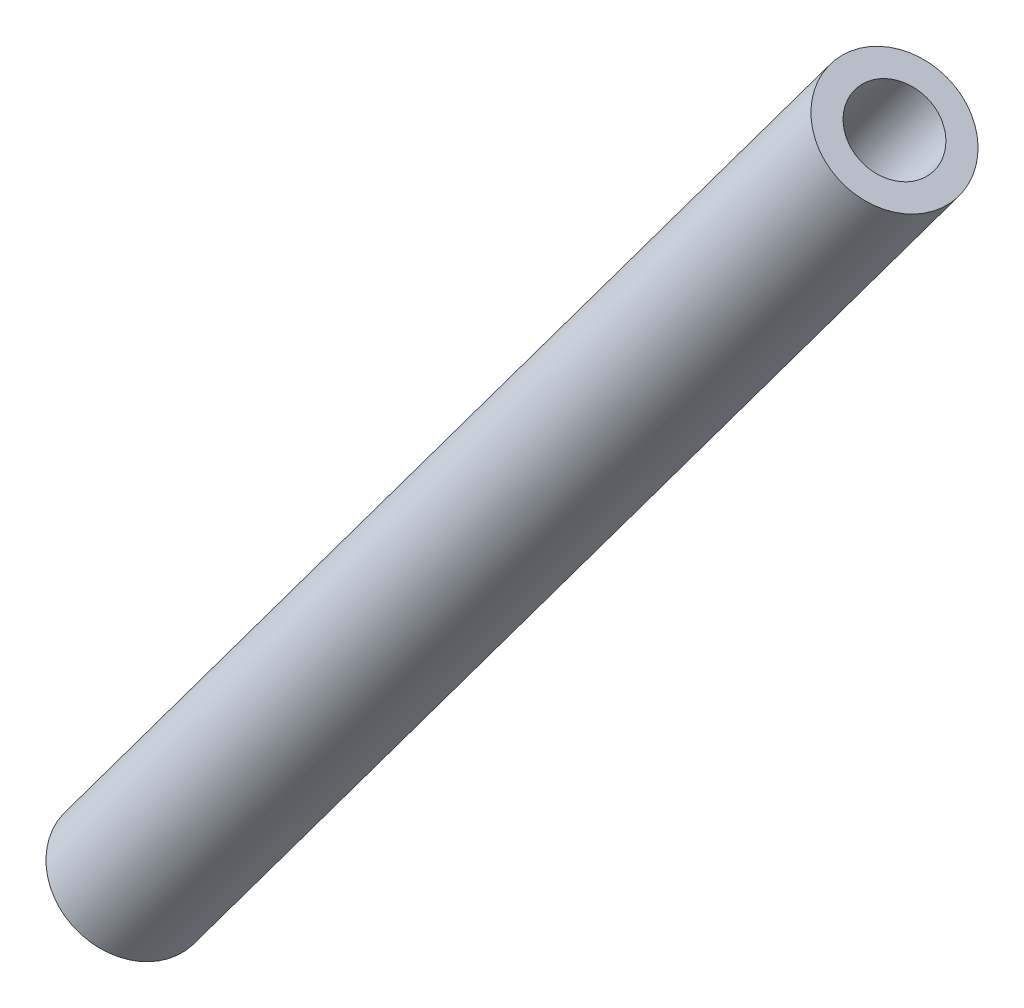
ISO-10303-21;
HEADER;
FILE_DESCRIPTION(('STEP AP214'),'2;1');
FILE_NAME('part.step','',(''),(''),'','','');
FILE_SCHEMA(('AUTOMOTIVE_DESIGN { 1 0 10303 214 1 1 1 1 }'));
ENDSEC;
DATA;
#1=APPLICATION_CONTEXT('core data for automotive mechanical design processes');
#2=APPLICATION_PROTOCOL_DEFINITION('international standard','automotive_design',2000,#1);
#3=PRODUCT_CONTEXT('',#1,'mechanical');
#4=PRODUCT('Part','Part','',(#3));
#5=PRODUCT_RELATED_PRODUCT_CATEGORY('part','',(#4));
#6=PRODUCT_DEFINITION_FORMATION('','',#4);
#7=PRODUCT_DEFINITION_CONTEXT('part definition',#1,'design');
#8=PRODUCT_DEFINITION('design','',#6,#7);
#9=PRODUCT_DEFINITION_SHAPE('','',#8);
#10=(LENGTH_UNIT() NAMED_UNIT(*) SI_UNIT(.MILLI.,.METRE.));
#11=(NAMED_UNIT(*) PLANE_ANGLE_UNIT() SI_UNIT($,.RADIAN.));
#12=(NAMED_UNIT(*) SI_UNIT($,.STERADIAN.) SOLID_ANGLE_UNIT());
#13=UNCERTAINTY_MEASURE_WITH_UNIT(LENGTH_MEASURE(1.E-05),#10,'distance_accuracy_value','');
#14=(GEOMETRIC_REPRESENTATION_CONTEXT(3) GLOBAL_UNCERTAINTY_ASSIGNED_CONTEXT((#13)) GLOBAL_UNIT_ASSIGNED_CONTEXT((#10,
#11,#12)) REPRESENTATION_CONTEXT('',''));
#15=CARTESIAN_POINT('',(0.,0.,0.));
#16=DIRECTION('',(0.,0.,1.));
#17=DIRECTION('',(1.,0.,0.));
#18=AXIS2_PLACEMENT_3D('',#15,#16,#17);
#19=CARTESIAN_POINT('',(0.,0.,0.));
#20=DIRECTION('',(0.596262476018023,0.802789548818902,0.));
#21=DIRECTION('',(-0.802789548818902,0.596262476018023,0.));
#22=AXIS2_PLACEMENT_3D('',#19,#20,#21);
#23=PLANE('',#22);
#24=CARTESIAN_POINT('',(0.,0.,0.));
#25=DIRECTION('',(0.596262476018023,0.802789548818902,0.));
#26=DIRECTION('',(-0.802789548818902,0.596262476018023,0.));
#27=AXIS2_PLACEMENT_3D('',#24,#25,#26);
#28=CIRCLE('',#27,6.35);
#29=CARTESIAN_POINT('',(-5.09771363500003,3.78626672271445,0.));
#30=VERTEX_POINT('',#29);
#31=EDGE_CURVE('E65',#30,#30,#28,.F.);
#32=ORIENTED_EDGE('',*,*,#31,.F.);
#33=EDGE_LOOP('',(#32));
#34=FACE_BOUND('',#33,.T.);
#35=CARTESIAN_POINT('',(0.,0.,0.));
#36=DIRECTION('',(0.596262476018023,0.802789548818902,0.));
#37=DIRECTION('',(-0.802789548818902,0.596262476018023,0.));
#38=AXIS2_PLACEMENT_3D('',#35,#36,#37);
#39=CIRCLE('',#38,10.31875);
#40=CARTESIAN_POINT('',(-8.28378465687504,6.15268342441098,0.));
#41=VERTEX_POINT('',#40);
#42=EDGE_CURVE('E57',#41,#41,#39,.T.);
#43=ORIENTED_EDGE('',*,*,#42,.F.);
#44=EDGE_LOOP('',(#43));
#45=FACE_BOUND('',#44,.T.);
#46=ADVANCED_FACE('F51',(#34,#45),#23,.F.);
#47=CARTESIAN_POINT('',(121.160535126862,163.126836320001,0.));
#48=DIRECTION('',(0.596262476018023,0.802789548818902,0.));
#49=DIRECTION('',(-0.802789548818902,0.596262476018023,0.));
#50=AXIS2_PLACEMENT_3D('',#47,#48,#49);
#51=PLANE('',#50);
#52=CARTESIAN_POINT('',(121.160535126862,163.126836320001,0.));
#53=DIRECTION('',(0.596262476018023,0.802789548818902,0.));
#54=DIRECTION('',(-0.802789548818902,0.596262476018023,0.));
#55=AXIS2_PLACEMENT_3D('',#52,#53,#54);
#56=CIRCLE('',#55,6.35);
#57=CARTESIAN_POINT('',(116.062821491862,166.913103042715,0.));
#58=VERTEX_POINT('',#57);
#59=EDGE_CURVE('E61',#58,#58,#56,.F.);
#60=ORIENTED_EDGE('',*,*,#59,.T.);
#61=EDGE_LOOP('',(#60));
#62=FACE_BOUND('',#61,.T.);
#63=CARTESIAN_POINT('',(121.160535126862,163.126836320001,0.));
#64=DIRECTION('',(0.596262476018023,0.802789548818902,0.));
#65=DIRECTION('',(-0.802789548818902,0.596262476018023,0.));
#66=AXIS2_PLACEMENT_3D('',#63,#64,#65);
#67=CIRCLE('',#66,10.31875);
#68=CARTESIAN_POINT('',(112.876750469987,169.279519744412,0.));
#69=VERTEX_POINT('',#68);
#70=EDGE_CURVE('E11',#69,#69,#67,.T.);
#71=ORIENTED_EDGE('',*,*,#70,.T.);
#72=EDGE_LOOP('',(#71));
#73=FACE_BOUND('',#72,.T.);
#74=ADVANCED_FACE('F76',(#62,#73),#51,.T.);
#75=CARTESIAN_POINT('',(0.,0.,0.));
#76=DIRECTION('',(0.596262476018023,0.802789548818902,0.));
#77=DIRECTION('',(-0.802789548818902,0.596262476018023,0.));
#78=AXIS2_PLACEMENT_3D('',#75,#76,#77);
#79=CYLINDRICAL_SURFACE('',#78,10.31875);
#80=ORIENTED_EDGE('',*,*,#70,.F.);
#81=EDGE_LOOP('',(#80));
#82=FACE_BOUND('',#81,.T.);
#83=ORIENTED_EDGE('',*,*,#42,.T.);
#84=EDGE_LOOP('',(#83));
#85=FACE_BOUND('',#84,.T.);
#86=ADVANCED_FACE('F81',(#82,#85),#79,.T.);
#87=CARTESIAN_POINT('',(-1.21160535126863,-1.63126836320001,0.));
#88=DIRECTION('',(0.596262476018023,0.802789548818902,0.));
#89=DIRECTION('',(-0.802789548818902,0.596262476018023,0.));
#90=AXIS2_PLACEMENT_3D('',#87,#88,#89);
#91=CYLINDRICAL_SURFACE('',#90,6.35);
#92=ORIENTED_EDGE('',*,*,#31,.T.);
#93=EDGE_LOOP('',(#92));
#94=FACE_BOUND('',#93,.T.);
#95=ORIENTED_EDGE('',*,*,#59,.F.);
#96=EDGE_LOOP('',(#95));
#97=FACE_BOUND('',#96,.T.);
#98=ADVANCED_FACE('F71',(#94,#97),#91,.F.);
#99=CLOSED_SHELL('',(#46,#74,#86,#98));
#100=MANIFOLD_SOLID_BREP('B2',#99);
#101=ADVANCED_BREP_SHAPE_REPRESENTATION('',(#18,#100),#14);
#102=SHAPE_DEFINITION_REPRESENTATION(#9,#101);
ENDSEC;
END-ISO-10303-21;
